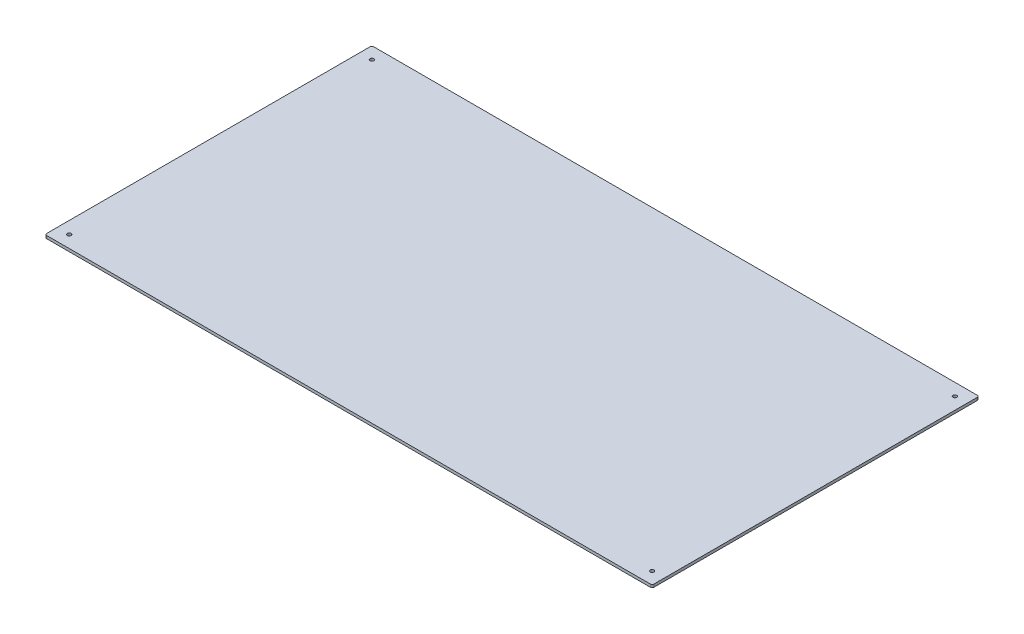
ISO-10303-21;
HEADER;
FILE_DESCRIPTION(('STEP AP214'),'2;1');
FILE_NAME('part.step','',(''),(''),'','','');
FILE_SCHEMA(('AUTOMOTIVE_DESIGN { 1 0 10303 214 1 1 1 1 }'));
ENDSEC;
DATA;
#1=APPLICATION_CONTEXT('core data for automotive mechanical design processes');
#2=APPLICATION_PROTOCOL_DEFINITION('international standard','automotive_design',2000,#1);
#3=PRODUCT_CONTEXT('',#1,'mechanical');
#4=PRODUCT('Part','Part','',(#3));
#5=PRODUCT_RELATED_PRODUCT_CATEGORY('part','',(#4));
#6=PRODUCT_DEFINITION_FORMATION('','',#4);
#7=PRODUCT_DEFINITION_CONTEXT('part definition',#1,'design');
#8=PRODUCT_DEFINITION('design','',#6,#7);
#9=PRODUCT_DEFINITION_SHAPE('','',#8);
#10=(LENGTH_UNIT() NAMED_UNIT(*) SI_UNIT(.MILLI.,.METRE.));
#11=(NAMED_UNIT(*) PLANE_ANGLE_UNIT() SI_UNIT($,.RADIAN.));
#12=(NAMED_UNIT(*) SI_UNIT($,.STERADIAN.) SOLID_ANGLE_UNIT());
#13=UNCERTAINTY_MEASURE_WITH_UNIT(LENGTH_MEASURE(1.E-05),#10,'distance_accuracy_value','');
#14=(GEOMETRIC_REPRESENTATION_CONTEXT(3) GLOBAL_UNCERTAINTY_ASSIGNED_CONTEXT((#13)) GLOBAL_UNIT_ASSIGNED_CONTEXT((#10,
#11,#12)) REPRESENTATION_CONTEXT('',''));
#15=CARTESIAN_POINT('',(0.,0.,0.));
#16=DIRECTION('',(0.,0.,1.));
#17=DIRECTION('',(1.,0.,0.));
#18=AXIS2_PLACEMENT_3D('',#15,#16,#17);
#19=CARTESIAN_POINT('',(648.,3.,-348.));
#20=DIRECTION('',(0.,-1.,0.));
#21=DIRECTION('',(0.,0.,-1.));
#22=AXIS2_PLACEMENT_3D('',#19,#20,#21);
#23=PLANE('',#22);
#24=CARTESIAN_POINT('',(648.,3.,-348.));
#25=DIRECTION('',(0.,1.,0.));
#26=DIRECTION('',(0.,0.,-1.));
#27=AXIS2_PLACEMENT_3D('',#24,#25,#26);
#28=CIRCLE('',#27,2.);
#29=CARTESIAN_POINT('',(650.,3.,-348.));
#30=VERTEX_POINT('',#29);
#31=CARTESIAN_POINT('',(648.,3.,-350.));
#32=VERTEX_POINT('',#31);
#33=EDGE_CURVE('E147',#30,#32,#28,.T.);
#34=ORIENTED_EDGE('',*,*,#33,.T.);
#35=DIRECTION('',(-1.,0.,0.));
#36=VECTOR('',#35,1.);
#37=CARTESIAN_POINT('',(2.,3.,-350.));
#38=LINE('',#37,#36);
#39=CARTESIAN_POINT('',(2.,3.,-350.));
#40=VERTEX_POINT('',#39);
#41=EDGE_CURVE('E95',#32,#40,#38,.T.);
#42=ORIENTED_EDGE('',*,*,#41,.T.);
#43=CARTESIAN_POINT('',(2.,3.,-348.));
#44=DIRECTION('',(0.,1.,0.));
#45=DIRECTION('',(0.,0.,1.));
#46=AXIS2_PLACEMENT_3D('',#43,#44,#45);
#47=CIRCLE('',#46,2.);
#48=CARTESIAN_POINT('',(0.,3.,-348.));
#49=VERTEX_POINT('',#48);
#50=EDGE_CURVE('E162',#40,#49,#47,.T.);
#51=ORIENTED_EDGE('',*,*,#50,.T.);
#52=DIRECTION('',(0.,0.,1.));
#53=VECTOR('',#52,1.);
#54=CARTESIAN_POINT('',(0.,3.,-2.00000000000001));
#55=LINE('',#54,#53);
#56=CARTESIAN_POINT('',(0.,3.,-2.00000000000001));
#57=VERTEX_POINT('',#56);
#58=EDGE_CURVE('E175',#49,#57,#55,.T.);
#59=ORIENTED_EDGE('',*,*,#58,.T.);
#60=CARTESIAN_POINT('',(2.,3.,-2.));
#61=DIRECTION('',(0.,1.,0.));
#62=DIRECTION('',(0.,0.,-1.));
#63=AXIS2_PLACEMENT_3D('',#60,#61,#62);
#64=CIRCLE('',#63,2.);
#65=CARTESIAN_POINT('',(2.00000000000001,3.,0.));
#66=VERTEX_POINT('',#65);
#67=EDGE_CURVE('E114',#57,#66,#64,.T.);
#68=ORIENTED_EDGE('',*,*,#67,.T.);
#69=DIRECTION('',(1.,0.,0.));
#70=VECTOR('',#69,1.);
#71=CARTESIAN_POINT('',(2.00000000000001,3.,0.));
#72=LINE('',#71,#70);
#73=CARTESIAN_POINT('',(648.,3.,0.));
#74=VERTEX_POINT('',#73);
#75=EDGE_CURVE('E108',#66,#74,#72,.T.);
#76=ORIENTED_EDGE('',*,*,#75,.T.);
#77=CARTESIAN_POINT('',(648.,3.,-2.));
#78=DIRECTION('',(0.,1.,0.));
#79=DIRECTION('',(0.,0.,1.));
#80=AXIS2_PLACEMENT_3D('',#77,#78,#79);
#81=CIRCLE('',#80,2.);
#82=CARTESIAN_POINT('',(650.,3.,-2.));
#83=VERTEX_POINT('',#82);
#84=EDGE_CURVE('E112',#74,#83,#81,.T.);
#85=ORIENTED_EDGE('',*,*,#84,.T.);
#86=DIRECTION('',(0.,0.,-1.));
#87=VECTOR('',#86,1.);
#88=CARTESIAN_POINT('',(650.,3.,-2.));
#89=LINE('',#88,#87);
#90=EDGE_CURVE('E52',#83,#30,#89,.T.);
#91=ORIENTED_EDGE('',*,*,#90,.T.);
#92=EDGE_LOOP('',(#34,#42,#51,#59,#68,#76,#85,#91));
#93=FACE_BOUND('',#92,.T.);
#94=CARTESIAN_POINT('',(13.,3.,-13.));
#95=DIRECTION('',(0.,1.,0.));
#96=DIRECTION('',(0.,0.,1.));
#97=AXIS2_PLACEMENT_3D('',#94,#95,#96);
#98=CIRCLE('',#97,2.);
#99=CARTESIAN_POINT('',(13.,3.,-11.));
#100=VERTEX_POINT('',#99);
#101=EDGE_CURVE('E136',#100,#100,#98,.T.);
#102=ORIENTED_EDGE('',*,*,#101,.F.);
#103=EDGE_LOOP('',(#102));
#104=FACE_BOUND('',#103,.T.);
#105=CARTESIAN_POINT('',(637.,3.,-13.));
#106=DIRECTION('',(0.,1.,0.));
#107=DIRECTION('',(0.,0.,1.));
#108=AXIS2_PLACEMENT_3D('',#105,#106,#107);
#109=CIRCLE('',#108,2.);
#110=CARTESIAN_POINT('',(637.,3.,-11.));
#111=VERTEX_POINT('',#110);
#112=EDGE_CURVE('E184',#111,#111,#109,.T.);
#113=ORIENTED_EDGE('',*,*,#112,.F.);
#114=EDGE_LOOP('',(#113));
#115=FACE_BOUND('',#114,.T.);
#116=CARTESIAN_POINT('',(13.,3.,-337.));
#117=DIRECTION('',(0.,1.,0.));
#118=DIRECTION('',(0.,0.,1.));
#119=AXIS2_PLACEMENT_3D('',#116,#117,#118);
#120=CIRCLE('',#119,2.);
#121=CARTESIAN_POINT('',(13.,3.,-335.));
#122=VERTEX_POINT('',#121);
#123=EDGE_CURVE('E190',#122,#122,#120,.T.);
#124=ORIENTED_EDGE('',*,*,#123,.F.);
#125=EDGE_LOOP('',(#124));
#126=FACE_BOUND('',#125,.T.);
#127=CARTESIAN_POINT('',(637.,3.,-337.));
#128=DIRECTION('',(0.,1.,0.));
#129=DIRECTION('',(0.,0.,1.));
#130=AXIS2_PLACEMENT_3D('',#127,#128,#129);
#131=CIRCLE('',#130,2.);
#132=CARTESIAN_POINT('',(637.,3.,-335.));
#133=VERTEX_POINT('',#132);
#134=EDGE_CURVE('E196',#133,#133,#131,.T.);
#135=ORIENTED_EDGE('',*,*,#134,.F.);
#136=EDGE_LOOP('',(#135));
#137=FACE_BOUND('',#136,.T.);
#138=ADVANCED_FACE('F35',(#93,#104,#115,#126,#137),#23,.F.);
#139=CARTESIAN_POINT('',(648.,0.,-348.));
#140=DIRECTION('',(0.,-1.,0.));
#141=DIRECTION('',(0.,0.,-1.));
#142=AXIS2_PLACEMENT_3D('',#139,#140,#141);
#143=PLANE('',#142);
#144=CARTESIAN_POINT('',(13.,0.,-337.));
#145=DIRECTION('',(0.,1.,0.));
#146=DIRECTION('',(0.,0.,1.));
#147=AXIS2_PLACEMENT_3D('',#144,#145,#146);
#148=CIRCLE('',#147,2.);
#149=CARTESIAN_POINT('',(13.,0.,-335.));
#150=VERTEX_POINT('',#149);
#151=EDGE_CURVE('E193',#150,#150,#148,.T.);
#152=ORIENTED_EDGE('',*,*,#151,.T.);
#153=EDGE_LOOP('',(#152));
#154=FACE_BOUND('',#153,.T.);
#155=CARTESIAN_POINT('',(13.,0.,-13.));
#156=DIRECTION('',(0.,1.,0.));
#157=DIRECTION('',(0.,0.,1.));
#158=AXIS2_PLACEMENT_3D('',#155,#156,#157);
#159=CIRCLE('',#158,2.);
#160=CARTESIAN_POINT('',(13.,0.,-11.));
#161=VERTEX_POINT('',#160);
#162=EDGE_CURVE('E181',#161,#161,#159,.T.);
#163=ORIENTED_EDGE('',*,*,#162,.T.);
#164=EDGE_LOOP('',(#163));
#165=FACE_BOUND('',#164,.T.);
#166=CARTESIAN_POINT('',(648.,0.,-348.));
#167=DIRECTION('',(0.,1.,0.));
#168=DIRECTION('',(0.,0.,-1.));
#169=AXIS2_PLACEMENT_3D('',#166,#167,#168);
#170=CIRCLE('',#169,2.);
#171=CARTESIAN_POINT('',(650.,0.,-348.));
#172=VERTEX_POINT('',#171);
#173=CARTESIAN_POINT('',(648.,0.,-350.));
#174=VERTEX_POINT('',#173);
#175=EDGE_CURVE('E132',#172,#174,#170,.T.);
#176=ORIENTED_EDGE('',*,*,#175,.F.);
#177=DIRECTION('',(0.,0.,-1.));
#178=VECTOR('',#177,1.);
#179=CARTESIAN_POINT('',(650.,0.,-2.));
#180=LINE('',#179,#178);
#181=CARTESIAN_POINT('',(650.,0.,-2.));
#182=VERTEX_POINT('',#181);
#183=EDGE_CURVE('E87',#182,#172,#180,.T.);
#184=ORIENTED_EDGE('',*,*,#183,.F.);
#185=CARTESIAN_POINT('',(648.,0.,-2.));
#186=DIRECTION('',(0.,1.,0.));
#187=DIRECTION('',(0.,0.,1.));
#188=AXIS2_PLACEMENT_3D('',#185,#186,#187);
#189=CIRCLE('',#188,2.);
#190=CARTESIAN_POINT('',(648.,0.,0.));
#191=VERTEX_POINT('',#190);
#192=EDGE_CURVE('E81',#191,#182,#189,.T.);
#193=ORIENTED_EDGE('',*,*,#192,.F.);
#194=DIRECTION('',(1.,0.,0.));
#195=VECTOR('',#194,1.);
#196=CARTESIAN_POINT('',(2.00000000000001,0.,0.));
#197=LINE('',#196,#195);
#198=CARTESIAN_POINT('',(2.00000000000001,0.,0.));
#199=VERTEX_POINT('',#198);
#200=EDGE_CURVE('E122',#199,#191,#197,.T.);
#201=ORIENTED_EDGE('',*,*,#200,.F.);
#202=CARTESIAN_POINT('',(2.,0.,-2.));
#203=DIRECTION('',(0.,1.,0.));
#204=DIRECTION('',(0.,0.,-1.));
#205=AXIS2_PLACEMENT_3D('',#202,#203,#204);
#206=CIRCLE('',#205,2.);
#207=CARTESIAN_POINT('',(0.,0.,-2.00000000000001));
#208=VERTEX_POINT('',#207);
#209=EDGE_CURVE('E142',#208,#199,#206,.T.);
#210=ORIENTED_EDGE('',*,*,#209,.F.);
#211=DIRECTION('',(0.,0.,1.));
#212=VECTOR('',#211,1.);
#213=CARTESIAN_POINT('',(0.,0.,-2.00000000000001));
#214=LINE('',#213,#212);
#215=CARTESIAN_POINT('',(0.,0.,-348.));
#216=VERTEX_POINT('',#215);
#217=EDGE_CURVE('E140',#216,#208,#214,.T.);
#218=ORIENTED_EDGE('',*,*,#217,.F.);
#219=CARTESIAN_POINT('',(2.,0.,-348.));
#220=DIRECTION('',(0.,1.,0.));
#221=DIRECTION('',(0.,0.,1.));
#222=AXIS2_PLACEMENT_3D('',#219,#220,#221);
#223=CIRCLE('',#222,2.);
#224=CARTESIAN_POINT('',(2.,0.,-350.));
#225=VERTEX_POINT('',#224);
#226=EDGE_CURVE('E138',#225,#216,#223,.T.);
#227=ORIENTED_EDGE('',*,*,#226,.F.);
#228=DIRECTION('',(-1.,0.,0.));
#229=VECTOR('',#228,1.);
#230=CARTESIAN_POINT('',(2.,0.,-350.));
#231=LINE('',#230,#229);
#232=EDGE_CURVE('E135',#174,#225,#231,.T.);
#233=ORIENTED_EDGE('',*,*,#232,.F.);
#234=EDGE_LOOP('',(#176,#184,#193,#201,#210,#218,#227,#233));
#235=FACE_BOUND('',#234,.T.);
#236=CARTESIAN_POINT('',(637.,0.,-13.));
#237=DIRECTION('',(0.,1.,0.));
#238=DIRECTION('',(0.,0.,1.));
#239=AXIS2_PLACEMENT_3D('',#236,#237,#238);
#240=CIRCLE('',#239,2.);
#241=CARTESIAN_POINT('',(637.,0.,-11.));
#242=VERTEX_POINT('',#241);
#243=EDGE_CURVE('E187',#242,#242,#240,.T.);
#244=ORIENTED_EDGE('',*,*,#243,.T.);
#245=EDGE_LOOP('',(#244));
#246=FACE_BOUND('',#245,.T.);
#247=CARTESIAN_POINT('',(637.,0.,-337.));
#248=DIRECTION('',(0.,1.,0.));
#249=DIRECTION('',(0.,0.,1.));
#250=AXIS2_PLACEMENT_3D('',#247,#248,#249);
#251=CIRCLE('',#250,2.);
#252=CARTESIAN_POINT('',(637.,0.,-335.));
#253=VERTEX_POINT('',#252);
#254=EDGE_CURVE('E199',#253,#253,#251,.T.);
#255=ORIENTED_EDGE('',*,*,#254,.T.);
#256=EDGE_LOOP('',(#255));
#257=FACE_BOUND('',#256,.T.);
#258=ADVANCED_FACE('F166',(#154,#165,#235,#246,#257),#143,.T.);
#259=CARTESIAN_POINT('',(648.,3.,-348.));
#260=DIRECTION('',(0.,-1.,0.));
#261=DIRECTION('',(0.,0.,-1.));
#262=AXIS2_PLACEMENT_3D('',#259,#260,#261);
#263=CYLINDRICAL_SURFACE('',#262,2.);
#264=ORIENTED_EDGE('',*,*,#175,.T.);
#265=DIRECTION('',(0.,-1.,0.));
#266=VECTOR('',#265,1.);
#267=CARTESIAN_POINT('',(648.,3.,-350.));
#268=LINE('',#267,#266);
#269=EDGE_CURVE('E11',#32,#174,#268,.T.);
#270=ORIENTED_EDGE('',*,*,#269,.F.);
#271=ORIENTED_EDGE('',*,*,#33,.F.);
#272=DIRECTION('',(0.,-1.,0.));
#273=VECTOR('',#272,1.);
#274=CARTESIAN_POINT('',(650.,3.,-348.));
#275=LINE('',#274,#273);
#276=EDGE_CURVE('E128',#30,#172,#275,.T.);
#277=ORIENTED_EDGE('',*,*,#276,.T.);
#278=EDGE_LOOP('',(#264,#270,#271,#277));
#279=FACE_BOUND('',#278,.T.);
#280=ADVANCED_FACE('F37',(#279),#263,.T.);
#281=CARTESIAN_POINT('',(2.,3.,-350.));
#282=DIRECTION('',(0.,0.,1.));
#283=DIRECTION('',(1.,0.,0.));
#284=AXIS2_PLACEMENT_3D('',#281,#282,#283);
#285=PLANE('',#284);
#286=ORIENTED_EDGE('',*,*,#232,.T.);
#287=DIRECTION('',(0.,-1.,0.));
#288=VECTOR('',#287,1.);
#289=CARTESIAN_POINT('',(2.,3.,-350.));
#290=LINE('',#289,#288);
#291=EDGE_CURVE('E44',#40,#225,#290,.T.);
#292=ORIENTED_EDGE('',*,*,#291,.F.);
#293=ORIENTED_EDGE('',*,*,#41,.F.);
#294=ORIENTED_EDGE('',*,*,#269,.T.);
#295=EDGE_LOOP('',(#286,#292,#293,#294));
#296=FACE_BOUND('',#295,.T.);
#297=ADVANCED_FACE('F231',(#296),#285,.F.);
#298=CARTESIAN_POINT('',(2.,3.,-348.));
#299=DIRECTION('',(0.,-1.,0.));
#300=DIRECTION('',(0.,0.,-1.));
#301=AXIS2_PLACEMENT_3D('',#298,#299,#300);
#302=CYLINDRICAL_SURFACE('',#301,2.);
#303=ORIENTED_EDGE('',*,*,#226,.T.);
#304=DIRECTION('',(0.,-1.,0.));
#305=VECTOR('',#304,1.);
#306=CARTESIAN_POINT('',(0.,3.,-348.));
#307=LINE('',#306,#305);
#308=EDGE_CURVE('E154',#49,#216,#307,.T.);
#309=ORIENTED_EDGE('',*,*,#308,.F.);
#310=ORIENTED_EDGE('',*,*,#50,.F.);
#311=ORIENTED_EDGE('',*,*,#291,.T.);
#312=EDGE_LOOP('',(#303,#309,#310,#311));
#313=FACE_BOUND('',#312,.T.);
#314=ADVANCED_FACE('F160',(#313),#302,.T.);
#315=CARTESIAN_POINT('',(0.,3.,-2.00000000000001));
#316=DIRECTION('',(1.,0.,0.));
#317=DIRECTION('',(0.,0.,-1.));
#318=AXIS2_PLACEMENT_3D('',#315,#316,#317);
#319=PLANE('',#318);
#320=ORIENTED_EDGE('',*,*,#217,.T.);
#321=DIRECTION('',(0.,-1.,0.));
#322=VECTOR('',#321,1.);
#323=CARTESIAN_POINT('',(0.,3.,-2.00000000000001));
#324=LINE('',#323,#322);
#325=EDGE_CURVE('E151',#57,#208,#324,.T.);
#326=ORIENTED_EDGE('',*,*,#325,.F.);
#327=ORIENTED_EDGE('',*,*,#58,.F.);
#328=ORIENTED_EDGE('',*,*,#308,.T.);
#329=EDGE_LOOP('',(#320,#326,#327,#328));
#330=FACE_BOUND('',#329,.T.);
#331=ADVANCED_FACE('F171',(#330),#319,.F.);
#332=CARTESIAN_POINT('',(2.,3.,-2.));
#333=DIRECTION('',(0.,-1.,0.));
#334=DIRECTION('',(0.,0.,-1.));
#335=AXIS2_PLACEMENT_3D('',#332,#333,#334);
#336=CYLINDRICAL_SURFACE('',#335,2.);
#337=ORIENTED_EDGE('',*,*,#209,.T.);
#338=DIRECTION('',(0.,-1.,0.));
#339=VECTOR('',#338,1.);
#340=CARTESIAN_POINT('',(2.00000000000001,3.,0.));
#341=LINE('',#340,#339);
#342=EDGE_CURVE('E123',#66,#199,#341,.T.);
#343=ORIENTED_EDGE('',*,*,#342,.F.);
#344=ORIENTED_EDGE('',*,*,#67,.F.);
#345=ORIENTED_EDGE('',*,*,#325,.T.);
#346=EDGE_LOOP('',(#337,#343,#344,#345));
#347=FACE_BOUND('',#346,.T.);
#348=ADVANCED_FACE('F174',(#347),#336,.T.);
#349=CARTESIAN_POINT('',(2.00000000000001,3.,0.));
#350=DIRECTION('',(0.,0.,-1.));
#351=DIRECTION('',(-1.,0.,0.));
#352=AXIS2_PLACEMENT_3D('',#349,#350,#351);
#353=PLANE('',#352);
#354=ORIENTED_EDGE('',*,*,#200,.T.);
#355=DIRECTION('',(0.,-1.,0.));
#356=VECTOR('',#355,1.);
#357=CARTESIAN_POINT('',(648.,3.,0.));
#358=LINE('',#357,#356);
#359=EDGE_CURVE('E119',#74,#191,#358,.T.);
#360=ORIENTED_EDGE('',*,*,#359,.F.);
#361=ORIENTED_EDGE('',*,*,#75,.F.);
#362=ORIENTED_EDGE('',*,*,#342,.T.);
#363=EDGE_LOOP('',(#354,#360,#361,#362));
#364=FACE_BOUND('',#363,.T.);
#365=ADVANCED_FACE('F120',(#364),#353,.F.);
#366=CARTESIAN_POINT('',(648.,3.,-2.));
#367=DIRECTION('',(0.,-1.,0.));
#368=DIRECTION('',(0.,0.,-1.));
#369=AXIS2_PLACEMENT_3D('',#366,#367,#368);
#370=CYLINDRICAL_SURFACE('',#369,2.);
#371=ORIENTED_EDGE('',*,*,#192,.T.);
#372=DIRECTION('',(0.,-1.,0.));
#373=VECTOR('',#372,1.);
#374=CARTESIAN_POINT('',(650.,3.,-2.));
#375=LINE('',#374,#373);
#376=EDGE_CURVE('E124',#83,#182,#375,.T.);
#377=ORIENTED_EDGE('',*,*,#376,.F.);
#378=ORIENTED_EDGE('',*,*,#84,.F.);
#379=ORIENTED_EDGE('',*,*,#359,.T.);
#380=EDGE_LOOP('',(#371,#377,#378,#379));
#381=FACE_BOUND('',#380,.T.);
#382=ADVANCED_FACE('F126',(#381),#370,.T.);
#383=CARTESIAN_POINT('',(650.,3.,-2.));
#384=DIRECTION('',(-1.,0.,0.));
#385=DIRECTION('',(0.,0.,1.));
#386=AXIS2_PLACEMENT_3D('',#383,#384,#385);
#387=PLANE('',#386);
#388=ORIENTED_EDGE('',*,*,#183,.T.);
#389=ORIENTED_EDGE('',*,*,#276,.F.);
#390=ORIENTED_EDGE('',*,*,#90,.F.);
#391=ORIENTED_EDGE('',*,*,#376,.T.);
#392=EDGE_LOOP('',(#388,#389,#390,#391));
#393=FACE_BOUND('',#392,.T.);
#394=ADVANCED_FACE('F219',(#393),#387,.F.);
#395=CARTESIAN_POINT('',(13.,3.,-13.));
#396=DIRECTION('',(0.,-1.,0.));
#397=DIRECTION('',(0.,0.,-1.));
#398=AXIS2_PLACEMENT_3D('',#395,#396,#397);
#399=CYLINDRICAL_SURFACE('',#398,2.);
#400=ORIENTED_EDGE('',*,*,#101,.T.);
#401=EDGE_LOOP('',(#400));
#402=FACE_BOUND('',#401,.T.);
#403=ORIENTED_EDGE('',*,*,#162,.F.);
#404=EDGE_LOOP('',(#403));
#405=FACE_BOUND('',#404,.T.);
#406=ADVANCED_FACE('F216',(#402,#405),#399,.F.);
#407=CARTESIAN_POINT('',(637.,3.,-13.));
#408=DIRECTION('',(0.,-1.,0.));
#409=DIRECTION('',(0.,0.,-1.));
#410=AXIS2_PLACEMENT_3D('',#407,#408,#409);
#411=CYLINDRICAL_SURFACE('',#410,2.);
#412=ORIENTED_EDGE('',*,*,#112,.T.);
#413=EDGE_LOOP('',(#412));
#414=FACE_BOUND('',#413,.T.);
#415=ORIENTED_EDGE('',*,*,#243,.F.);
#416=EDGE_LOOP('',(#415));
#417=FACE_BOUND('',#416,.T.);
#418=ADVANCED_FACE('F295',(#414,#417),#411,.F.);
#419=CARTESIAN_POINT('',(13.,3.,-337.));
#420=DIRECTION('',(0.,-1.,0.));
#421=DIRECTION('',(0.,0.,-1.));
#422=AXIS2_PLACEMENT_3D('',#419,#420,#421);
#423=CYLINDRICAL_SURFACE('',#422,2.);
#424=ORIENTED_EDGE('',*,*,#123,.T.);
#425=EDGE_LOOP('',(#424));
#426=FACE_BOUND('',#425,.T.);
#427=ORIENTED_EDGE('',*,*,#151,.F.);
#428=EDGE_LOOP('',(#427));
#429=FACE_BOUND('',#428,.T.);
#430=ADVANCED_FACE('F303',(#426,#429),#423,.F.);
#431=CARTESIAN_POINT('',(637.,3.,-337.));
#432=DIRECTION('',(0.,-1.,0.));
#433=DIRECTION('',(0.,0.,-1.));
#434=AXIS2_PLACEMENT_3D('',#431,#432,#433);
#435=CYLINDRICAL_SURFACE('',#434,2.);
#436=ORIENTED_EDGE('',*,*,#134,.T.);
#437=EDGE_LOOP('',(#436));
#438=FACE_BOUND('',#437,.T.);
#439=ORIENTED_EDGE('',*,*,#254,.F.);
#440=EDGE_LOOP('',(#439));
#441=FACE_BOUND('',#440,.T.);
#442=ADVANCED_FACE('F205',(#438,#441),#435,.F.);
#443=CLOSED_SHELL('',(#138,#258,#280,#297,#314,#331,#348,#365,#382,#394,#406,#418,#430,#442));
#444=MANIFOLD_SOLID_BREP('B2',#443);
#445=ADVANCED_BREP_SHAPE_REPRESENTATION('',(#18,#444),#14);
#446=SHAPE_DEFINITION_REPRESENTATION(#9,#445);
ENDSEC;
END-ISO-10303-21;
